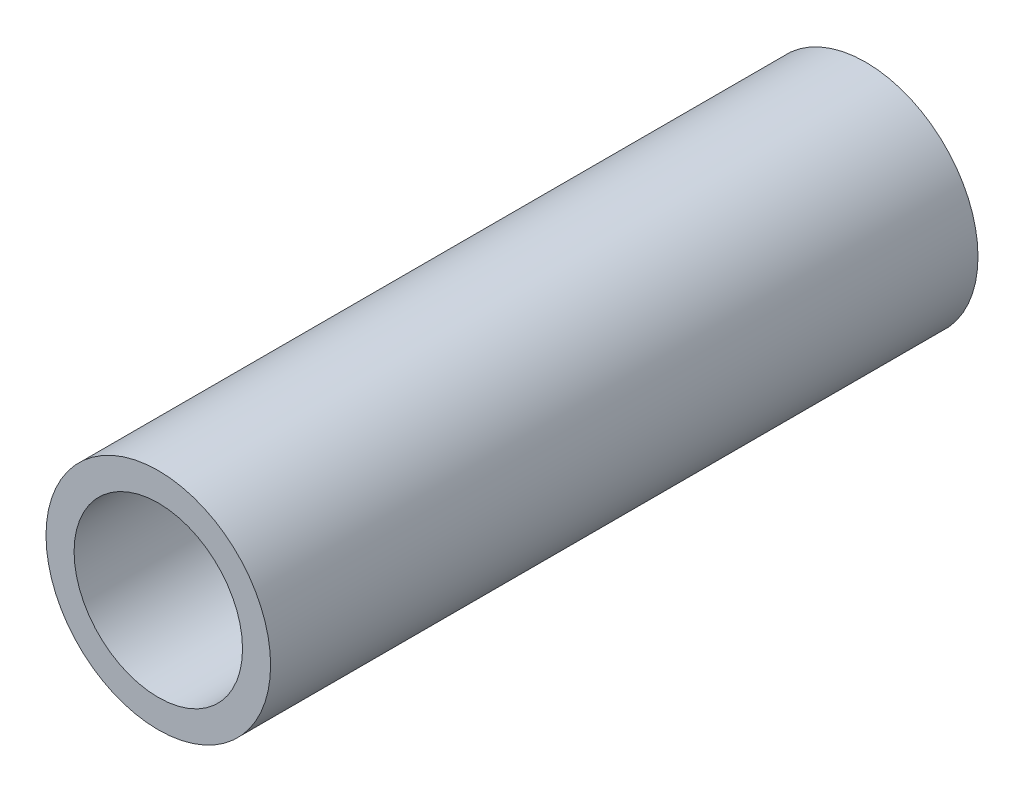
ISO-10303-21;
HEADER;
FILE_DESCRIPTION(('STEP AP214'),'2;1');
FILE_NAME('part.step','',(''),(''),'','','');
FILE_SCHEMA(('AUTOMOTIVE_DESIGN { 1 0 10303 214 1 1 1 1 }'));
ENDSEC;
DATA;
#1=APPLICATION_CONTEXT('core data for automotive mechanical design processes');
#2=APPLICATION_PROTOCOL_DEFINITION('international standard','automotive_design',2000,#1);
#3=PRODUCT_CONTEXT('',#1,'mechanical');
#4=PRODUCT('Part','Part','',(#3));
#5=PRODUCT_RELATED_PRODUCT_CATEGORY('part','',(#4));
#6=PRODUCT_DEFINITION_FORMATION('','',#4);
#7=PRODUCT_DEFINITION_CONTEXT('part definition',#1,'design');
#8=PRODUCT_DEFINITION('design','',#6,#7);
#9=PRODUCT_DEFINITION_SHAPE('','',#8);
#10=(LENGTH_UNIT() NAMED_UNIT(*) SI_UNIT(.MILLI.,.METRE.));
#11=(NAMED_UNIT(*) PLANE_ANGLE_UNIT() SI_UNIT($,.RADIAN.));
#12=(NAMED_UNIT(*) SI_UNIT($,.STERADIAN.) SOLID_ANGLE_UNIT());
#13=UNCERTAINTY_MEASURE_WITH_UNIT(LENGTH_MEASURE(1.E-05),#10,'distance_accuracy_value','');
#14=(GEOMETRIC_REPRESENTATION_CONTEXT(3) GLOBAL_UNCERTAINTY_ASSIGNED_CONTEXT((#13)) GLOBAL_UNIT_ASSIGNED_CONTEXT((#10,
#11,#12)) REPRESENTATION_CONTEXT('',''));
#15=CARTESIAN_POINT('',(0.,0.,0.));
#16=DIRECTION('',(0.,0.,1.));
#17=DIRECTION('',(1.,0.,0.));
#18=AXIS2_PLACEMENT_3D('',#15,#16,#17);
#19=CARTESIAN_POINT('',(0.,0.,20.));
#20=DIRECTION('',(0.,0.,1.));
#21=DIRECTION('',(1.,0.,0.));
#22=AXIS2_PLACEMENT_3D('',#19,#20,#21);
#23=PLANE('',#22);
#24=CARTESIAN_POINT('',(0.,0.,20.));
#25=DIRECTION('',(0.,0.,1.));
#26=DIRECTION('',(1.,0.,0.));
#27=AXIS2_PLACEMENT_3D('',#24,#25,#26);
#28=CIRCLE('',#27,3.175);
#29=CARTESIAN_POINT('',(3.175,0.,20.));
#30=VERTEX_POINT('',#29);
#31=EDGE_CURVE('E10',#30,#30,#28,.T.);
#32=ORIENTED_EDGE('',*,*,#31,.T.);
#33=EDGE_LOOP('',(#32));
#34=FACE_BOUND('',#33,.T.);
#35=CARTESIAN_POINT('',(0.,0.,20.));
#36=DIRECTION('',(0.,0.,1.));
#37=DIRECTION('',(1.,0.,0.));
#38=AXIS2_PLACEMENT_3D('',#35,#36,#37);
#39=CIRCLE('',#38,2.38125);
#40=CARTESIAN_POINT('',(2.38125,0.,20.));
#41=VERTEX_POINT('',#40);
#42=EDGE_CURVE('E41',#41,#41,#39,.T.);
#43=ORIENTED_EDGE('',*,*,#42,.F.);
#44=EDGE_LOOP('',(#43));
#45=FACE_BOUND('',#44,.T.);
#46=ADVANCED_FACE('F30',(#34,#45),#23,.T.);
#47=CARTESIAN_POINT('',(0.,0.,0.));
#48=DIRECTION('',(0.,0.,1.));
#49=DIRECTION('',(1.,0.,0.));
#50=AXIS2_PLACEMENT_3D('',#47,#48,#49);
#51=PLANE('',#50);
#52=CARTESIAN_POINT('',(0.,0.,0.));
#53=DIRECTION('',(0.,0.,1.));
#54=DIRECTION('',(1.,0.,0.));
#55=AXIS2_PLACEMENT_3D('',#52,#53,#54);
#56=CIRCLE('',#55,3.175);
#57=CARTESIAN_POINT('',(3.175,0.,0.));
#58=VERTEX_POINT('',#57);
#59=EDGE_CURVE('E34',#58,#58,#56,.T.);
#60=ORIENTED_EDGE('',*,*,#59,.F.);
#61=EDGE_LOOP('',(#60));
#62=FACE_BOUND('',#61,.T.);
#63=CARTESIAN_POINT('',(0.,0.,0.));
#64=DIRECTION('',(0.,0.,1.));
#65=DIRECTION('',(1.,0.,0.));
#66=AXIS2_PLACEMENT_3D('',#63,#64,#65);
#67=CIRCLE('',#66,2.38125);
#68=CARTESIAN_POINT('',(2.38125,0.,0.));
#69=VERTEX_POINT('',#68);
#70=EDGE_CURVE('E43',#69,#69,#67,.T.);
#71=ORIENTED_EDGE('',*,*,#70,.T.);
#72=EDGE_LOOP('',(#71));
#73=FACE_BOUND('',#72,.T.);
#74=ADVANCED_FACE('F53',(#62,#73),#51,.F.);
#75=CARTESIAN_POINT('',(0.,0.,20.));
#76=DIRECTION('',(0.,0.,-1.));
#77=DIRECTION('',(-1.,0.,0.));
#78=AXIS2_PLACEMENT_3D('',#75,#76,#77);
#79=CYLINDRICAL_SURFACE('',#78,3.175);
#80=ORIENTED_EDGE('',*,*,#31,.F.);
#81=EDGE_LOOP('',(#80));
#82=FACE_BOUND('',#81,.T.);
#83=ORIENTED_EDGE('',*,*,#59,.T.);
#84=EDGE_LOOP('',(#83));
#85=FACE_BOUND('',#84,.T.);
#86=ADVANCED_FACE('F32',(#82,#85),#79,.T.);
#87=CARTESIAN_POINT('',(0.,0.,20.));
#88=DIRECTION('',(0.,0.,-1.));
#89=DIRECTION('',(-1.,0.,0.));
#90=AXIS2_PLACEMENT_3D('',#87,#88,#89);
#91=CYLINDRICAL_SURFACE('',#90,2.38125);
#92=ORIENTED_EDGE('',*,*,#42,.T.);
#93=EDGE_LOOP('',(#92));
#94=FACE_BOUND('',#93,.T.);
#95=ORIENTED_EDGE('',*,*,#70,.F.);
#96=EDGE_LOOP('',(#95));
#97=FACE_BOUND('',#96,.T.);
#98=ADVANCED_FACE('F49',(#94,#97),#91,.F.);
#99=CLOSED_SHELL('',(#46,#74,#86,#98));
#100=MANIFOLD_SOLID_BREP('B2',#99);
#101=ADVANCED_BREP_SHAPE_REPRESENTATION('',(#18,#100),#14);
#102=SHAPE_DEFINITION_REPRESENTATION(#9,#101);
ENDSEC;
END-ISO-10303-21;
